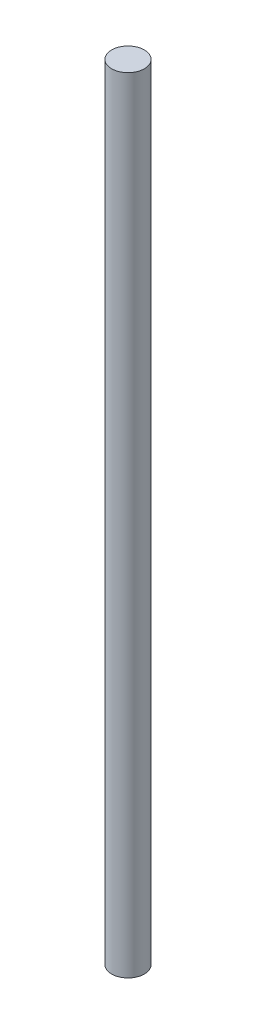
ISO-10303-21;
HEADER;
FILE_DESCRIPTION(('STEP AP214'),'2;1');
FILE_NAME('part.step','',(''),(''),'','','');
FILE_SCHEMA(('AUTOMOTIVE_DESIGN { 1 0 10303 214 1 1 1 1 }'));
ENDSEC;
DATA;
#1=APPLICATION_CONTEXT('core data for automotive mechanical design processes');
#2=APPLICATION_PROTOCOL_DEFINITION('international standard','automotive_design',2000,#1);
#3=PRODUCT_CONTEXT('',#1,'mechanical');
#4=PRODUCT('Part','Part','',(#3));
#5=PRODUCT_RELATED_PRODUCT_CATEGORY('part','',(#4));
#6=PRODUCT_DEFINITION_FORMATION('','',#4);
#7=PRODUCT_DEFINITION_CONTEXT('part definition',#1,'design');
#8=PRODUCT_DEFINITION('design','',#6,#7);
#9=PRODUCT_DEFINITION_SHAPE('','',#8);
#10=(LENGTH_UNIT() NAMED_UNIT(*) SI_UNIT(.MILLI.,.METRE.));
#11=(NAMED_UNIT(*) PLANE_ANGLE_UNIT() SI_UNIT($,.RADIAN.));
#12=(NAMED_UNIT(*) SI_UNIT($,.STERADIAN.) SOLID_ANGLE_UNIT());
#13=UNCERTAINTY_MEASURE_WITH_UNIT(LENGTH_MEASURE(1.E-05),#10,'distance_accuracy_value','');
#14=(GEOMETRIC_REPRESENTATION_CONTEXT(3) GLOBAL_UNCERTAINTY_ASSIGNED_CONTEXT((#13)) GLOBAL_UNIT_ASSIGNED_CONTEXT((#10,
#11,#12)) REPRESENTATION_CONTEXT('',''));
#15=CARTESIAN_POINT('',(0.,0.,0.));
#16=DIRECTION('',(0.,0.,1.));
#17=DIRECTION('',(1.,0.,0.));
#18=AXIS2_PLACEMENT_3D('',#15,#16,#17);
#19=CARTESIAN_POINT('',(0.,60.,0.));
#20=DIRECTION('',(0.,-1.,0.));
#21=DIRECTION('',(0.,0.,-1.));
#22=AXIS2_PLACEMENT_3D('',#19,#20,#21);
#23=CYLINDRICAL_SURFACE('',#22,1.25);
#24=CARTESIAN_POINT('',(0.,60.,0.));
#25=DIRECTION('',(0.,1.,0.));
#26=DIRECTION('',(0.,0.,1.));
#27=AXIS2_PLACEMENT_3D('',#24,#25,#26);
#28=CIRCLE('',#27,1.25);
#29=CARTESIAN_POINT('',(0.,60.,-1.25));
#30=VERTEX_POINT('',#29);
#31=EDGE_CURVE('E10',#30,#30,#28,.T.);
#32=CARTESIAN_POINT('',(0.,0.,0.));
#33=DIRECTION('',(0.,1.,0.));
#34=DIRECTION('',(0.,0.,1.));
#35=AXIS2_PLACEMENT_3D('',#32,#33,#34);
#36=CIRCLE('',#35,1.25);
#37=CARTESIAN_POINT('',(0.,0.,-1.25));
#38=VERTEX_POINT('',#37);
#39=EDGE_CURVE('E40',#38,#38,#36,.T.);
#40=CARTESIAN_POINT('',(0.,60.,-1.25));
#41=CARTESIAN_POINT('',(0.,59.375,-1.25));
#42=CARTESIAN_POINT('',(0.,58.75,-1.25));
#43=CARTESIAN_POINT('',(0.,57.5,-1.25));
#44=CARTESIAN_POINT('',(0.,56.875,-1.25));
#45=CARTESIAN_POINT('',(0.,55.625,-1.25));
#46=CARTESIAN_POINT('',(0.,55.,-1.25));
#47=CARTESIAN_POINT('',(0.,53.75,-1.25));
#48=CARTESIAN_POINT('',(0.,53.125,-1.25));
#49=CARTESIAN_POINT('',(0.,51.875,-1.25));
#50=CARTESIAN_POINT('',(0.,51.25,-1.25));
#51=CARTESIAN_POINT('',(0.,50.,-1.25));
#52=CARTESIAN_POINT('',(0.,49.375,-1.25));
#53=CARTESIAN_POINT('',(0.,48.125,-1.25));
#54=CARTESIAN_POINT('',(0.,47.5,-1.25));
#55=CARTESIAN_POINT('',(0.,46.25,-1.25));
#56=CARTESIAN_POINT('',(0.,45.625,-1.25));
#57=CARTESIAN_POINT('',(0.,44.375,-1.25));
#58=CARTESIAN_POINT('',(0.,43.75,-1.25));
#59=CARTESIAN_POINT('',(0.,42.5,-1.25));
#60=CARTESIAN_POINT('',(0.,41.875,-1.25));
#61=CARTESIAN_POINT('',(0.,40.625,-1.25));
#62=CARTESIAN_POINT('',(0.,40.,-1.25));
#63=CARTESIAN_POINT('',(0.,38.75,-1.25));
#64=CARTESIAN_POINT('',(0.,38.125,-1.25));
#65=CARTESIAN_POINT('',(0.,36.875,-1.25));
#66=CARTESIAN_POINT('',(0.,36.25,-1.25));
#67=CARTESIAN_POINT('',(0.,35.,-1.25));
#68=CARTESIAN_POINT('',(0.,34.375,-1.25));
#69=CARTESIAN_POINT('',(0.,33.125,-1.25));
#70=CARTESIAN_POINT('',(0.,32.5,-1.25));
#71=CARTESIAN_POINT('',(0.,31.25,-1.25));
#72=CARTESIAN_POINT('',(0.,30.625,-1.25));
#73=CARTESIAN_POINT('',(0.,29.375,-1.25));
#74=CARTESIAN_POINT('',(0.,28.75,-1.25));
#75=CARTESIAN_POINT('',(0.,27.5,-1.25));
#76=CARTESIAN_POINT('',(0.,26.875,-1.25));
#77=CARTESIAN_POINT('',(0.,25.625,-1.25));
#78=CARTESIAN_POINT('',(0.,25.,-1.25));
#79=CARTESIAN_POINT('',(0.,23.75,-1.25));
#80=CARTESIAN_POINT('',(0.,23.125,-1.25));
#81=CARTESIAN_POINT('',(0.,21.875,-1.25));
#82=CARTESIAN_POINT('',(0.,21.25,-1.25));
#83=CARTESIAN_POINT('',(0.,20.,-1.25));
#84=CARTESIAN_POINT('',(0.,19.375,-1.25));
#85=CARTESIAN_POINT('',(0.,18.125,-1.25));
#86=CARTESIAN_POINT('',(0.,17.5,-1.25));
#87=CARTESIAN_POINT('',(0.,16.25,-1.25));
#88=CARTESIAN_POINT('',(0.,15.625,-1.25));
#89=CARTESIAN_POINT('',(0.,14.375,-1.25));
#90=CARTESIAN_POINT('',(0.,13.75,-1.25));
#91=CARTESIAN_POINT('',(0.,12.5,-1.25));
#92=CARTESIAN_POINT('',(0.,11.875,-1.25));
#93=CARTESIAN_POINT('',(0.,10.625,-1.25));
#94=CARTESIAN_POINT('',(0.,10.,-1.25));
#95=CARTESIAN_POINT('',(0.,8.75,-1.25));
#96=CARTESIAN_POINT('',(0.,8.125,-1.25));
#97=CARTESIAN_POINT('',(0.,6.875,-1.25));
#98=CARTESIAN_POINT('',(0.,6.25,-1.25));
#99=CARTESIAN_POINT('',(0.,5.,-1.25));
#100=CARTESIAN_POINT('',(0.,4.375,-1.25));
#101=CARTESIAN_POINT('',(0.,3.125,-1.25));
#102=CARTESIAN_POINT('',(0.,2.5,-1.25));
#103=CARTESIAN_POINT('',(0.,1.25,-1.25));
#104=CARTESIAN_POINT('',(0.,0.625000000000001,-1.25));
#105=CARTESIAN_POINT('',(0.,0.,-1.25));
#106=B_SPLINE_CURVE_WITH_KNOTS('',3,(#40,#41,#42,#43,#44,#45,#46,#47,#48,#49,#50,#51,#52,#53,
#54,#55,#56,#57,#58,#59,#60,#61,#62,#63,#64,#65,#66,#67,#68,#69,#70,#71,#72,#73,#74,#75,#76,#77,
#78,#79,#80,#81,#82,#83,#84,#85,#86,#87,#88,#89,#90,#91,#92,#93,#94,#95,#96,#97,#98,#99,#100,
#101,#102,#103,#104,#105),.UNSPECIFIED.,.F.,.F.,(4,2,2,2,2,2,2,2,2,2,2,2,2,2,2,2,2,2,2,2,2,2,2,
2,2,2,2,2,2,2,2,2,4),(0.,1.875,3.75,5.62500000000001,7.50000000000001,9.375,11.25,13.125,15.,
16.875,18.75,20.625,22.5,24.375,26.25,28.125,30.,31.875,33.75,35.625,37.5,39.375,41.25,43.125,
45.,46.875,48.75,50.625,52.5,54.375,56.25,58.125,60.),.UNSPECIFIED.);
#107=EDGE_CURVE('BSEAM37',#30,#38,#106,.T.);
#108=ORIENTED_EDGE('',*,*,#31,.F.);
#109=ORIENTED_EDGE('',*,*,#39,.T.);
#110=ORIENTED_EDGE('',*,*,#107,.T.);
#111=ORIENTED_EDGE('',*,*,#107,.F.);
#112=EDGE_LOOP('',(#108,#110,#109,#111));
#113=FACE_BOUND('',#112,.T.);
#114=ADVANCED_FACE('F37',(#113),#23,.T.);
#115=CARTESIAN_POINT('',(0.,60.,0.));
#116=DIRECTION('',(0.,1.,0.));
#117=DIRECTION('',(0.,0.,1.));
#118=AXIS2_PLACEMENT_3D('',#115,#116,#117);
#119=PLANE('',#118);
#120=ORIENTED_EDGE('',*,*,#31,.T.);
#121=EDGE_LOOP('',(#120));
#122=FACE_BOUND('',#121,.T.);
#123=ADVANCED_FACE('F54',(#122),#119,.T.);
#124=CARTESIAN_POINT('',(0.,0.,0.));
#125=DIRECTION('',(0.,1.,0.));
#126=DIRECTION('',(0.,0.,1.));
#127=AXIS2_PLACEMENT_3D('',#124,#125,#126);
#128=PLANE('',#127);
#129=ORIENTED_EDGE('',*,*,#39,.F.);
#130=EDGE_LOOP('',(#129));
#131=FACE_BOUND('',#130,.T.);
#132=ADVANCED_FACE('F52',(#131),#128,.F.);
#133=CLOSED_SHELL('',(#114,#123,#132));
#134=MANIFOLD_SOLID_BREP('B2',#133);
#135=ADVANCED_BREP_SHAPE_REPRESENTATION('',(#18,#134),#14);
#136=SHAPE_DEFINITION_REPRESENTATION(#9,#135);
ENDSEC;
END-ISO-10303-21;
